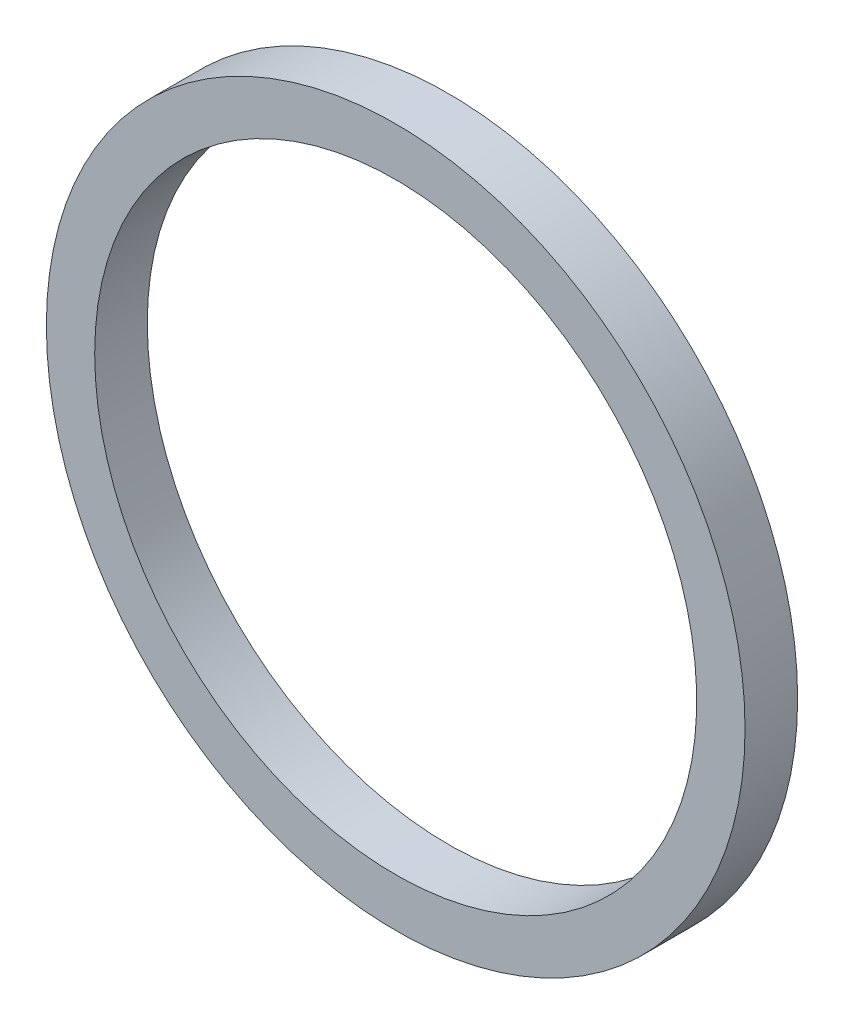
ISO-10303-21;
HEADER;
FILE_DESCRIPTION(('STEP AP214'),'2;1');
FILE_NAME('part.step','',(''),(''),'','','');
FILE_SCHEMA(('AUTOMOTIVE_DESIGN { 1 0 10303 214 1 1 1 1 }'));
ENDSEC;
DATA;
#1=APPLICATION_CONTEXT('core data for automotive mechanical design processes');
#2=APPLICATION_PROTOCOL_DEFINITION('international standard','automotive_design',2000,#1);
#3=PRODUCT_CONTEXT('',#1,'mechanical');
#4=PRODUCT('Part','Part','',(#3));
#5=PRODUCT_RELATED_PRODUCT_CATEGORY('part','',(#4));
#6=PRODUCT_DEFINITION_FORMATION('','',#4);
#7=PRODUCT_DEFINITION_CONTEXT('part definition',#1,'design');
#8=PRODUCT_DEFINITION('design','',#6,#7);
#9=PRODUCT_DEFINITION_SHAPE('','',#8);
#10=(LENGTH_UNIT() NAMED_UNIT(*) SI_UNIT(.MILLI.,.METRE.));
#11=(NAMED_UNIT(*) PLANE_ANGLE_UNIT() SI_UNIT($,.RADIAN.));
#12=(NAMED_UNIT(*) SI_UNIT($,.STERADIAN.) SOLID_ANGLE_UNIT());
#13=UNCERTAINTY_MEASURE_WITH_UNIT(LENGTH_MEASURE(1.E-05),#10,'distance_accuracy_value','');
#14=(GEOMETRIC_REPRESENTATION_CONTEXT(3) GLOBAL_UNCERTAINTY_ASSIGNED_CONTEXT((#13)) GLOBAL_UNIT_ASSIGNED_CONTEXT((#10,
#11,#12)) REPRESENTATION_CONTEXT('',''));
#15=CARTESIAN_POINT('',(0.,0.,0.));
#16=DIRECTION('',(0.,0.,1.));
#17=DIRECTION('',(1.,0.,0.));
#18=AXIS2_PLACEMENT_3D('',#15,#16,#17);
#19=CARTESIAN_POINT('',(0.,0.,3.32));
#20=DIRECTION('',(0.,0.,1.));
#21=DIRECTION('',(1.,0.,0.));
#22=AXIS2_PLACEMENT_3D('',#19,#20,#21);
#23=PLANE('',#22);
#24=CARTESIAN_POINT('',(0.,0.,3.32));
#25=DIRECTION('',(0.,0.,1.));
#26=DIRECTION('',(1.,0.,0.));
#27=AXIS2_PLACEMENT_3D('',#24,#25,#26);
#28=CIRCLE('',#27,22.05);
#29=CARTESIAN_POINT('',(-22.05,0.,3.32));
#30=VERTEX_POINT('',#29);
#31=EDGE_CURVE('E10',#30,#30,#28,.T.);
#32=ORIENTED_EDGE('',*,*,#31,.T.);
#33=EDGE_LOOP('',(#32));
#34=FACE_BOUND('',#33,.T.);
#35=CARTESIAN_POINT('',(0.,0.,3.32));
#36=DIRECTION('',(0.,0.,1.));
#37=DIRECTION('',(1.,0.,0.));
#38=AXIS2_PLACEMENT_3D('',#35,#36,#37);
#39=CIRCLE('',#38,19.);
#40=CARTESIAN_POINT('',(-19.,0.,3.32));
#41=VERTEX_POINT('',#40);
#42=EDGE_CURVE('E45',#41,#41,#39,.T.);
#43=ORIENTED_EDGE('',*,*,#42,.F.);
#44=EDGE_LOOP('',(#43));
#45=FACE_BOUND('',#44,.T.);
#46=ADVANCED_FACE('F34',(#34,#45),#23,.T.);
#47=CARTESIAN_POINT('',(0.,0.,0.));
#48=DIRECTION('',(0.,0.,1.));
#49=DIRECTION('',(1.,0.,0.));
#50=AXIS2_PLACEMENT_3D('',#47,#48,#49);
#51=PLANE('',#50);
#52=CARTESIAN_POINT('',(0.,0.,0.));
#53=DIRECTION('',(0.,0.,1.));
#54=DIRECTION('',(1.,0.,0.));
#55=AXIS2_PLACEMENT_3D('',#52,#53,#54);
#56=CIRCLE('',#55,22.05);
#57=CARTESIAN_POINT('',(-22.05,0.,0.));
#58=VERTEX_POINT('',#57);
#59=EDGE_CURVE('E38',#58,#58,#56,.T.);
#60=ORIENTED_EDGE('',*,*,#59,.F.);
#61=EDGE_LOOP('',(#60));
#62=FACE_BOUND('',#61,.T.);
#63=CARTESIAN_POINT('',(0.,0.,0.));
#64=DIRECTION('',(0.,0.,1.));
#65=DIRECTION('',(1.,0.,0.));
#66=AXIS2_PLACEMENT_3D('',#63,#64,#65);
#67=CIRCLE('',#66,19.);
#68=CARTESIAN_POINT('',(-19.,0.,0.));
#69=VERTEX_POINT('',#68);
#70=EDGE_CURVE('E47',#69,#69,#67,.T.);
#71=ORIENTED_EDGE('',*,*,#70,.T.);
#72=EDGE_LOOP('',(#71));
#73=FACE_BOUND('',#72,.T.);
#74=ADVANCED_FACE('F57',(#62,#73),#51,.F.);
#75=CARTESIAN_POINT('',(0.,0.,3.32));
#76=DIRECTION('',(0.,0.,-1.));
#77=DIRECTION('',(-1.,0.,0.));
#78=AXIS2_PLACEMENT_3D('',#75,#76,#77);
#79=CYLINDRICAL_SURFACE('',#78,22.05);
#80=CARTESIAN_POINT('',(-22.05,0.,3.32));
#81=CARTESIAN_POINT('',(-22.05,0.,3.28541666666667));
#82=CARTESIAN_POINT('',(-22.05,0.,3.25083333333333));
#83=CARTESIAN_POINT('',(-22.05,0.,3.18166666666667));
#84=CARTESIAN_POINT('',(-22.05,0.,3.14708333333333));
#85=CARTESIAN_POINT('',(-22.05,0.,3.07791666666667));
#86=CARTESIAN_POINT('',(-22.05,0.,3.04333333333333));
#87=CARTESIAN_POINT('',(-22.05,0.,2.97416666666667));
#88=CARTESIAN_POINT('',(-22.05,0.,2.93958333333333));
#89=CARTESIAN_POINT('',(-22.05,0.,2.87041666666667));
#90=CARTESIAN_POINT('',(-22.05,0.,2.83583333333333));
#91=CARTESIAN_POINT('',(-22.05,0.,2.76666666666667));
#92=CARTESIAN_POINT('',(-22.05,0.,2.73208333333333));
#93=CARTESIAN_POINT('',(-22.05,0.,2.66291666666667));
#94=CARTESIAN_POINT('',(-22.05,0.,2.62833333333333));
#95=CARTESIAN_POINT('',(-22.05,0.,2.55916666666667));
#96=CARTESIAN_POINT('',(-22.05,0.,2.52458333333333));
#97=CARTESIAN_POINT('',(-22.05,0.,2.45541666666667));
#98=CARTESIAN_POINT('',(-22.05,0.,2.42083333333333));
#99=CARTESIAN_POINT('',(-22.05,0.,2.35166666666667));
#100=CARTESIAN_POINT('',(-22.05,0.,2.31708333333333));
#101=CARTESIAN_POINT('',(-22.05,0.,2.24791666666667));
#102=CARTESIAN_POINT('',(-22.05,0.,2.21333333333333));
#103=CARTESIAN_POINT('',(-22.05,0.,2.14416666666667));
#104=CARTESIAN_POINT('',(-22.05,0.,2.10958333333333));
#105=CARTESIAN_POINT('',(-22.05,0.,2.04041666666667));
#106=CARTESIAN_POINT('',(-22.05,0.,2.00583333333333));
#107=CARTESIAN_POINT('',(-22.05,0.,1.93666666666667));
#108=CARTESIAN_POINT('',(-22.05,0.,1.90208333333333));
#109=CARTESIAN_POINT('',(-22.05,0.,1.83291666666667));
#110=CARTESIAN_POINT('',(-22.05,0.,1.79833333333333));
#111=CARTESIAN_POINT('',(-22.05,0.,1.72916666666667));
#112=CARTESIAN_POINT('',(-22.05,0.,1.69458333333333));
#113=CARTESIAN_POINT('',(-22.05,0.,1.62541666666667));
#114=CARTESIAN_POINT('',(-22.05,0.,1.59083333333333));
#115=CARTESIAN_POINT('',(-22.05,0.,1.52166666666667));
#116=CARTESIAN_POINT('',(-22.05,0.,1.48708333333333));
#117=CARTESIAN_POINT('',(-22.05,0.,1.41791666666667));
#118=CARTESIAN_POINT('',(-22.05,0.,1.38333333333333));
#119=CARTESIAN_POINT('',(-22.05,0.,1.31416666666667));
#120=CARTESIAN_POINT('',(-22.05,0.,1.27958333333333));
#121=CARTESIAN_POINT('',(-22.05,0.,1.21041666666667));
#122=CARTESIAN_POINT('',(-22.05,0.,1.17583333333333));
#123=CARTESIAN_POINT('',(-22.05,0.,1.10666666666667));
#124=CARTESIAN_POINT('',(-22.05,0.,1.07208333333333));
#125=CARTESIAN_POINT('',(-22.05,0.,1.00291666666667));
#126=CARTESIAN_POINT('',(-22.05,0.,0.968333333333333));
#127=CARTESIAN_POINT('',(-22.05,0.,0.899166666666666));
#128=CARTESIAN_POINT('',(-22.05,0.,0.864583333333333));
#129=CARTESIAN_POINT('',(-22.05,0.,0.795416666666666));
#130=CARTESIAN_POINT('',(-22.05,0.,0.760833333333333));
#131=CARTESIAN_POINT('',(-22.05,0.,0.691666666666667));
#132=CARTESIAN_POINT('',(-22.05,0.,0.657083333333333));
#133=CARTESIAN_POINT('',(-22.05,0.,0.587916666666666));
#134=CARTESIAN_POINT('',(-22.05,0.,0.553333333333333));
#135=CARTESIAN_POINT('',(-22.05,0.,0.484166666666666));
#136=CARTESIAN_POINT('',(-22.05,0.,0.449583333333333));
#137=CARTESIAN_POINT('',(-22.05,0.,0.380416666666666));
#138=CARTESIAN_POINT('',(-22.05,0.,0.345833333333333));
#139=CARTESIAN_POINT('',(-22.05,0.,0.276666666666666));
#140=CARTESIAN_POINT('',(-22.05,0.,0.242083333333333));
#141=CARTESIAN_POINT('',(-22.05,0.,0.172916666666666));
#142=CARTESIAN_POINT('',(-22.05,0.,0.138333333333333));
#143=CARTESIAN_POINT('',(-22.05,0.,0.0691666666666663));
#144=CARTESIAN_POINT('',(-22.05,0.,0.0345833333333329));
#145=CARTESIAN_POINT('',(-22.05,0.,0.));
#146=B_SPLINE_CURVE_WITH_KNOTS('',3,(#80,#81,#82,#83,#84,#85,#86,#87,#88,#89,#90,#91,#92,#93,
#94,#95,#96,#97,#98,#99,#100,#101,#102,#103,#104,#105,#106,#107,#108,#109,#110,#111,#112,#113,
#114,#115,#116,#117,#118,#119,#120,#121,#122,#123,#124,#125,#126,#127,#128,#129,#130,#131,#132,
#133,#134,#135,#136,#137,#138,#139,#140,#141,#142,#143,#144,#145),.UNSPECIFIED.,.F.,.F.,(4,2,2,
2,2,2,2,2,2,2,2,2,2,2,2,2,2,2,2,2,2,2,2,2,2,2,2,2,2,2,2,2,4),(0.,0.10375,0.2075,0.31125,0.415,
0.51875,0.6225,0.72625,0.83,0.933750000000001,1.0375,1.14125,1.245,1.34875,1.4525,1.55625,1.66,
1.76375,1.8675,1.97125,2.075,2.17875,2.2825,2.38625,2.49,2.59375,2.6975,2.80125,2.905,3.00875,
3.1125,3.21625,3.32),.UNSPECIFIED.);
#147=EDGE_CURVE('BSEAM36',#30,#58,#146,.T.);
#148=ORIENTED_EDGE('',*,*,#31,.F.);
#149=ORIENTED_EDGE('',*,*,#59,.T.);
#150=ORIENTED_EDGE('',*,*,#147,.T.);
#151=ORIENTED_EDGE('',*,*,#147,.F.);
#152=EDGE_LOOP('',(#148,#150,#149,#151));
#153=FACE_BOUND('',#152,.T.);
#154=ADVANCED_FACE('F36',(#153),#79,.T.);
#155=CARTESIAN_POINT('',(0.,0.,3.32));
#156=DIRECTION('',(0.,0.,-1.));
#157=DIRECTION('',(-1.,0.,0.));
#158=AXIS2_PLACEMENT_3D('',#155,#156,#157);
#159=CYLINDRICAL_SURFACE('',#158,19.);
#160=CARTESIAN_POINT('',(-19.,0.,3.32));
#161=CARTESIAN_POINT('',(-19.,0.,3.28541666666667));
#162=CARTESIAN_POINT('',(-19.,0.,3.25083333333333));
#163=CARTESIAN_POINT('',(-19.,0.,3.18166666666667));
#164=CARTESIAN_POINT('',(-19.,0.,3.14708333333333));
#165=CARTESIAN_POINT('',(-19.,0.,3.07791666666667));
#166=CARTESIAN_POINT('',(-19.,0.,3.04333333333333));
#167=CARTESIAN_POINT('',(-19.,0.,2.97416666666667));
#168=CARTESIAN_POINT('',(-19.,0.,2.93958333333333));
#169=CARTESIAN_POINT('',(-19.,0.,2.87041666666667));
#170=CARTESIAN_POINT('',(-19.,0.,2.83583333333333));
#171=CARTESIAN_POINT('',(-19.,0.,2.76666666666667));
#172=CARTESIAN_POINT('',(-19.,0.,2.73208333333333));
#173=CARTESIAN_POINT('',(-19.,0.,2.66291666666667));
#174=CARTESIAN_POINT('',(-19.,0.,2.62833333333333));
#175=CARTESIAN_POINT('',(-19.,0.,2.55916666666667));
#176=CARTESIAN_POINT('',(-19.,0.,2.52458333333333));
#177=CARTESIAN_POINT('',(-19.,0.,2.45541666666667));
#178=CARTESIAN_POINT('',(-19.,0.,2.42083333333333));
#179=CARTESIAN_POINT('',(-19.,0.,2.35166666666667));
#180=CARTESIAN_POINT('',(-19.,0.,2.31708333333333));
#181=CARTESIAN_POINT('',(-19.,0.,2.24791666666667));
#182=CARTESIAN_POINT('',(-19.,0.,2.21333333333333));
#183=CARTESIAN_POINT('',(-19.,0.,2.14416666666667));
#184=CARTESIAN_POINT('',(-19.,0.,2.10958333333333));
#185=CARTESIAN_POINT('',(-19.,0.,2.04041666666667));
#186=CARTESIAN_POINT('',(-19.,0.,2.00583333333333));
#187=CARTESIAN_POINT('',(-19.,0.,1.93666666666667));
#188=CARTESIAN_POINT('',(-19.,0.,1.90208333333333));
#189=CARTESIAN_POINT('',(-19.,0.,1.83291666666667));
#190=CARTESIAN_POINT('',(-19.,0.,1.79833333333333));
#191=CARTESIAN_POINT('',(-19.,0.,1.72916666666667));
#192=CARTESIAN_POINT('',(-19.,0.,1.69458333333333));
#193=CARTESIAN_POINT('',(-19.,0.,1.62541666666667));
#194=CARTESIAN_POINT('',(-19.,0.,1.59083333333333));
#195=CARTESIAN_POINT('',(-19.,0.,1.52166666666667));
#196=CARTESIAN_POINT('',(-19.,0.,1.48708333333333));
#197=CARTESIAN_POINT('',(-19.,0.,1.41791666666667));
#198=CARTESIAN_POINT('',(-19.,0.,1.38333333333333));
#199=CARTESIAN_POINT('',(-19.,0.,1.31416666666667));
#200=CARTESIAN_POINT('',(-19.,0.,1.27958333333333));
#201=CARTESIAN_POINT('',(-19.,0.,1.21041666666667));
#202=CARTESIAN_POINT('',(-19.,0.,1.17583333333333));
#203=CARTESIAN_POINT('',(-19.,0.,1.10666666666667));
#204=CARTESIAN_POINT('',(-19.,0.,1.07208333333333));
#205=CARTESIAN_POINT('',(-19.,0.,1.00291666666667));
#206=CARTESIAN_POINT('',(-19.,0.,0.968333333333333));
#207=CARTESIAN_POINT('',(-19.,0.,0.899166666666666));
#208=CARTESIAN_POINT('',(-19.,0.,0.864583333333333));
#209=CARTESIAN_POINT('',(-19.,0.,0.795416666666666));
#210=CARTESIAN_POINT('',(-19.,0.,0.760833333333333));
#211=CARTESIAN_POINT('',(-19.,0.,0.691666666666667));
#212=CARTESIAN_POINT('',(-19.,0.,0.657083333333333));
#213=CARTESIAN_POINT('',(-19.,0.,0.587916666666666));
#214=CARTESIAN_POINT('',(-19.,0.,0.553333333333333));
#215=CARTESIAN_POINT('',(-19.,0.,0.484166666666666));
#216=CARTESIAN_POINT('',(-19.,0.,0.449583333333333));
#217=CARTESIAN_POINT('',(-19.,0.,0.380416666666666));
#218=CARTESIAN_POINT('',(-19.,0.,0.345833333333333));
#219=CARTESIAN_POINT('',(-19.,0.,0.276666666666666));
#220=CARTESIAN_POINT('',(-19.,0.,0.242083333333333));
#221=CARTESIAN_POINT('',(-19.,0.,0.172916666666666));
#222=CARTESIAN_POINT('',(-19.,0.,0.138333333333333));
#223=CARTESIAN_POINT('',(-19.,0.,0.0691666666666663));
#224=CARTESIAN_POINT('',(-19.,0.,0.0345833333333329));
#225=CARTESIAN_POINT('',(-19.,0.,0.));
#226=B_SPLINE_CURVE_WITH_KNOTS('',3,(#160,#161,#162,#163,#164,#165,#166,#167,#168,#169,#170,
#171,#172,#173,#174,#175,#176,#177,#178,#179,#180,#181,#182,#183,#184,#185,#186,#187,#188,#189,
#190,#191,#192,#193,#194,#195,#196,#197,#198,#199,#200,#201,#202,#203,#204,#205,#206,#207,#208,
#209,#210,#211,#212,#213,#214,#215,#216,#217,#218,#219,#220,#221,#222,#223,#224,#225),
.UNSPECIFIED.,.F.,.F.,(4,2,2,2,2,2,2,2,2,2,2,2,2,2,2,2,2,2,2,2,2,2,2,2,2,2,2,2,2,2,2,2,4),(0.,
0.10375,0.2075,0.31125,0.415,0.51875,0.6225,0.72625,0.83,0.933750000000001,1.0375,1.14125,1.245,
1.34875,1.4525,1.55625,1.66,1.76375,1.8675,1.97125,2.075,2.17875,2.2825,2.38625,2.49,2.59375,
2.6975,2.80125,2.905,3.00875,3.1125,3.21625,3.32),.UNSPECIFIED.);
#227=EDGE_CURVE('BSEAM53',#41,#69,#226,.T.);
#228=ORIENTED_EDGE('',*,*,#42,.T.);
#229=ORIENTED_EDGE('',*,*,#70,.F.);
#230=ORIENTED_EDGE('',*,*,#227,.T.);
#231=ORIENTED_EDGE('',*,*,#227,.F.);
#232=EDGE_LOOP('',(#228,#230,#229,#231));
#233=FACE_BOUND('',#232,.T.);
#234=ADVANCED_FACE('F53',(#233),#159,.F.);
#235=CLOSED_SHELL('',(#46,#74,#154,#234));
#236=MANIFOLD_SOLID_BREP('B2',#235);
#237=ADVANCED_BREP_SHAPE_REPRESENTATION('',(#18,#236),#14);
#238=SHAPE_DEFINITION_REPRESENTATION(#9,#237);
ENDSEC;
END-ISO-10303-21;
